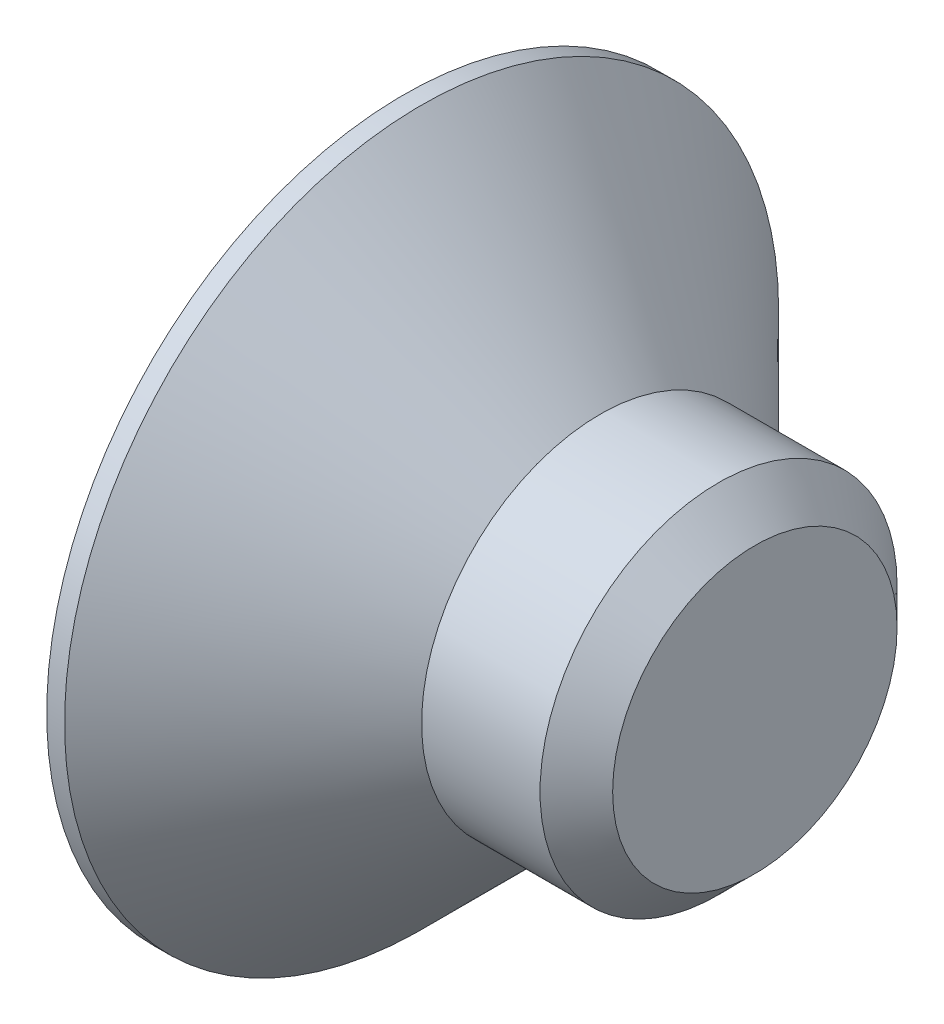
ISO-10303-21;
HEADER;
FILE_DESCRIPTION(('STEP AP214'),'2;1');
FILE_NAME('part.step','',(''),(''),'','','');
FILE_SCHEMA(('AUTOMOTIVE_DESIGN { 1 0 10303 214 1 1 1 1 }'));
ENDSEC;
DATA;
#1=APPLICATION_CONTEXT('core data for automotive mechanical design processes');
#2=APPLICATION_PROTOCOL_DEFINITION('international standard','automotive_design',2000,#1);
#3=PRODUCT_CONTEXT('',#1,'mechanical');
#4=PRODUCT('Part','Part','',(#3));
#5=PRODUCT_RELATED_PRODUCT_CATEGORY('part','',(#4));
#6=PRODUCT_DEFINITION_FORMATION('','',#4);
#7=PRODUCT_DEFINITION_CONTEXT('part definition',#1,'design');
#8=PRODUCT_DEFINITION('design','',#6,#7);
#9=PRODUCT_DEFINITION_SHAPE('','',#8);
#10=(LENGTH_UNIT() NAMED_UNIT(*) SI_UNIT(.MILLI.,.METRE.));
#11=(NAMED_UNIT(*) PLANE_ANGLE_UNIT() SI_UNIT($,.RADIAN.));
#12=(NAMED_UNIT(*) SI_UNIT($,.STERADIAN.) SOLID_ANGLE_UNIT());
#13=UNCERTAINTY_MEASURE_WITH_UNIT(LENGTH_MEASURE(1.E-05),#10,'distance_accuracy_value','');
#14=(GEOMETRIC_REPRESENTATION_CONTEXT(3) GLOBAL_UNCERTAINTY_ASSIGNED_CONTEXT((#13)) GLOBAL_UNIT_ASSIGNED_CONTEXT((#10,
#11,#12)) REPRESENTATION_CONTEXT('',''));
#15=CARTESIAN_POINT('',(0.,0.,0.));
#16=DIRECTION('',(0.,0.,1.));
#17=DIRECTION('',(1.,0.,0.));
#18=AXIS2_PLACEMENT_3D('',#15,#16,#17);
#19=CARTESIAN_POINT('',(500.,0.,0.));
#20=DIRECTION('',(1.,0.,0.));
#21=DIRECTION('',(0.,0.,-1.));
#22=AXIS2_PLACEMENT_3D('',#19,#20,#21);
#23=CYLINDRICAL_SURFACE('',#22,3.);
#24=CARTESIAN_POINT('',(5.28999999999996,0.,0.));
#25=DIRECTION('',(1.,0.,0.));
#26=DIRECTION('',(0.,0.,-1.));
#27=AXIS2_PLACEMENT_3D('',#24,#25,#26);
#28=CIRCLE('',#27,3.);
#29=CARTESIAN_POINT('',(5.28999999999996,0.,-3.));
#30=VERTEX_POINT('',#29);
#31=EDGE_CURVE('E11',#30,#30,#28,.F.);
#32=ORIENTED_EDGE('',*,*,#31,.T.);
#33=EDGE_LOOP('',(#32));
#34=FACE_BOUND('',#33,.T.);
#35=CARTESIAN_POINT('',(3.30000000000007,0.,0.));
#36=DIRECTION('',(1.,0.,0.));
#37=DIRECTION('',(0.,0.,-1.));
#38=AXIS2_PLACEMENT_3D('',#35,#36,#37);
#39=CIRCLE('',#38,3.);
#40=CARTESIAN_POINT('',(3.30000000000007,0.,-3.));
#41=VERTEX_POINT('',#40);
#42=EDGE_CURVE('E243',#41,#41,#39,.T.);
#43=ORIENTED_EDGE('',*,*,#42,.T.);
#44=EDGE_LOOP('',(#43));
#45=FACE_BOUND('',#44,.T.);
#46=ADVANCED_FACE('F40',(#34,#45),#23,.T.);
#47=CARTESIAN_POINT('',(0.,2.01,0.));
#48=DIRECTION('',(1.,0.,0.));
#49=DIRECTION('',(0.,0.,-1.));
#50=AXIS2_PLACEMENT_3D('',#47,#48,#49);
#51=PLANE('',#50);
#52=CARTESIAN_POINT('',(0.,0.,0.));
#53=DIRECTION('',(1.,0.,0.));
#54=DIRECTION('',(0.,0.,-1.));
#55=AXIS2_PLACEMENT_3D('',#52,#53,#54);
#56=CIRCLE('',#55,6.);
#57=CARTESIAN_POINT('',(0.,0.,-6.));
#58=VERTEX_POINT('',#57);
#59=EDGE_CURVE('E141',#58,#58,#56,.T.);
#60=ORIENTED_EDGE('',*,*,#59,.F.);
#61=EDGE_LOOP('',(#60));
#62=FACE_BOUND('',#61,.T.);
#63=DIRECTION('',(0.,-0.500000000000017,0.866025403784429));
#64=VECTOR('',#63,1.);
#65=CARTESIAN_POINT('',(0.,-1.1604740410711,-2.01));
#66=LINE('',#65,#64);
#67=CARTESIAN_POINT('',(0.,-1.1604740410711,-2.01));
#68=VERTEX_POINT('',#67);
#69=CARTESIAN_POINT('',(0.,-2.3209480821423,0.));
#70=VERTEX_POINT('',#69);
#71=EDGE_CURVE('E125',#68,#70,#66,.T.);
#72=ORIENTED_EDGE('',*,*,#71,.F.);
#73=DIRECTION('',(0.,-1.,0.));
#74=VECTOR('',#73,1.);
#75=CARTESIAN_POINT('',(0.,1.1604740410711,-2.01));
#76=LINE('',#75,#74);
#77=CARTESIAN_POINT('',(0.,1.1604740410711,-2.01));
#78=VERTEX_POINT('',#77);
#79=EDGE_CURVE('E113',#78,#68,#76,.T.);
#80=ORIENTED_EDGE('',*,*,#79,.F.);
#81=DIRECTION('',(0.,-0.500000000000017,-0.866025403784429));
#82=VECTOR('',#81,1.);
#83=CARTESIAN_POINT('',(0.,2.3209480821423,0.));
#84=LINE('',#83,#82);
#85=CARTESIAN_POINT('',(0.,2.3209480821423,0.));
#86=VERTEX_POINT('',#85);
#87=EDGE_CURVE('E124',#86,#78,#84,.T.);
#88=ORIENTED_EDGE('',*,*,#87,.F.);
#89=DIRECTION('',(0.,0.500000000000017,-0.866025403784429));
#90=VECTOR('',#89,1.);
#91=CARTESIAN_POINT('',(0.,1.1604740410711,2.01));
#92=LINE('',#91,#90);
#93=CARTESIAN_POINT('',(0.,1.1604740410711,2.01));
#94=VERTEX_POINT('',#93);
#95=EDGE_CURVE('E151',#94,#86,#92,.T.);
#96=ORIENTED_EDGE('',*,*,#95,.F.);
#97=DIRECTION('',(0.,1.,0.));
#98=VECTOR('',#97,1.);
#99=CARTESIAN_POINT('',(0.,-1.1604740410711,2.01));
#100=LINE('',#99,#98);
#101=CARTESIAN_POINT('',(0.,-1.1604740410711,2.01));
#102=VERTEX_POINT('',#101);
#103=EDGE_CURVE('E155',#102,#94,#100,.T.);
#104=ORIENTED_EDGE('',*,*,#103,.F.);
#105=DIRECTION('',(0.,0.500000000000017,0.866025403784429));
#106=VECTOR('',#105,1.);
#107=CARTESIAN_POINT('',(0.,-2.3209480821423,0.));
#108=LINE('',#107,#106);
#109=EDGE_CURVE('E140',#70,#102,#108,.T.);
#110=ORIENTED_EDGE('',*,*,#109,.F.);
#111=EDGE_LOOP('',(#72,#80,#88,#96,#104,#110));
#112=FACE_BOUND('',#111,.T.);
#113=ADVANCED_FACE('F138',(#62,#112),#51,.F.);
#114=CARTESIAN_POINT('',(500.,0.,0.));
#115=DIRECTION('',(1.,0.,0.));
#116=DIRECTION('',(0.,0.,-1.));
#117=AXIS2_PLACEMENT_3D('',#114,#115,#116);
#118=CYLINDRICAL_SURFACE('',#117,6.);
#119=CARTESIAN_POINT('',(0.300000000000078,0.,0.));
#120=DIRECTION('',(1.,0.,0.));
#121=DIRECTION('',(0.,0.,-1.));
#122=AXIS2_PLACEMENT_3D('',#119,#120,#121);
#123=CIRCLE('',#122,6.);
#124=CARTESIAN_POINT('',(0.300000000000078,0.,-6.));
#125=VERTEX_POINT('',#124);
#126=EDGE_CURVE('E162',#125,#125,#123,.T.);
#127=ORIENTED_EDGE('',*,*,#126,.F.);
#128=EDGE_LOOP('',(#127));
#129=FACE_BOUND('',#128,.T.);
#130=ORIENTED_EDGE('',*,*,#59,.T.);
#131=EDGE_LOOP('',(#130));
#132=FACE_BOUND('',#131,.T.);
#133=ADVANCED_FACE('F293',(#129,#132),#118,.T.);
#134=CARTESIAN_POINT('',(1.98,-2.3209480821423,0.));
#135=DIRECTION('',(0.,0.866025403784429,0.500000000000017));
#136=DIRECTION('',(0.,-0.500000000000017,0.866025403784429));
#137=AXIS2_PLACEMENT_3D('',#134,#135,#136);
#138=PLANE('',#137);
#139=DIRECTION('',(0.,0.500000000000017,-0.866025403784429));
#140=VECTOR('',#139,1.);
#141=CARTESIAN_POINT('',(1.98,-2.3209480821423,0.));
#142=LINE('',#141,#140);
#143=CARTESIAN_POINT('',(1.98,-2.3209480821423,0.));
#144=VERTEX_POINT('',#143);
#145=CARTESIAN_POINT('',(1.98,-1.74071106160668,-1.00500000000002));
#146=VERTEX_POINT('',#145);
#147=EDGE_CURVE('E167',#144,#146,#142,.T.);
#148=ORIENTED_EDGE('',*,*,#147,.T.);
#149=DIRECTION('',(0.,0.500000000000017,-0.866025403784429));
#150=VECTOR('',#149,1.);
#151=CARTESIAN_POINT('',(1.98,-1.74071106160669,-1.00500000000002));
#152=LINE('',#151,#150);
#153=CARTESIAN_POINT('',(1.98,-1.1604740410711,-2.01));
#154=VERTEX_POINT('',#153);
#155=EDGE_CURVE('E134',#146,#154,#152,.T.);
#156=ORIENTED_EDGE('',*,*,#155,.T.);
#157=DIRECTION('',(-1.,0.,0.));
#158=VECTOR('',#157,1.);
#159=CARTESIAN_POINT('',(1.98,-1.1604740410711,-2.01));
#160=LINE('',#159,#158);
#161=EDGE_CURVE('E117',#154,#68,#160,.T.);
#162=ORIENTED_EDGE('',*,*,#161,.T.);
#163=ORIENTED_EDGE('',*,*,#71,.T.);
#164=DIRECTION('',(-1.,0.,0.));
#165=VECTOR('',#164,1.);
#166=CARTESIAN_POINT('',(1.98,-2.3209480821423,0.));
#167=LINE('',#166,#165);
#168=EDGE_CURVE('E135',#144,#70,#167,.T.);
#169=ORIENTED_EDGE('',*,*,#168,.F.);
#170=EDGE_LOOP('',(#148,#156,#162,#163,#169));
#171=FACE_BOUND('',#170,.T.);
#172=ADVANCED_FACE('F131',(#171),#138,.T.);
#173=CARTESIAN_POINT('',(1.98,-1.1604740410711,-2.01));
#174=DIRECTION('',(0.,0.,1.));
#175=DIRECTION('',(1.,0.,0.));
#176=AXIS2_PLACEMENT_3D('',#173,#174,#175);
#177=PLANE('',#176);
#178=DIRECTION('',(0.,1.,0.));
#179=VECTOR('',#178,1.);
#180=CARTESIAN_POINT('',(1.98,-1.1604740410711,-2.01));
#181=LINE('',#180,#179);
#182=CARTESIAN_POINT('',(1.98,0.,-2.01));
#183=VERTEX_POINT('',#182);
#184=EDGE_CURVE('E177',#154,#183,#181,.T.);
#185=ORIENTED_EDGE('',*,*,#184,.T.);
#186=DIRECTION('',(0.,1.,0.));
#187=VECTOR('',#186,1.);
#188=CARTESIAN_POINT('',(1.98,0.,-2.01));
#189=LINE('',#188,#187);
#190=CARTESIAN_POINT('',(1.98,1.1604740410711,-2.01));
#191=VERTEX_POINT('',#190);
#192=EDGE_CURVE('E181',#183,#191,#189,.T.);
#193=ORIENTED_EDGE('',*,*,#192,.T.);
#194=DIRECTION('',(-1.,0.,0.));
#195=VECTOR('',#194,1.);
#196=CARTESIAN_POINT('',(1.98,1.1604740410711,-2.01));
#197=LINE('',#196,#195);
#198=EDGE_CURVE('E120',#191,#78,#197,.T.);
#199=ORIENTED_EDGE('',*,*,#198,.T.);
#200=ORIENTED_EDGE('',*,*,#79,.T.);
#201=ORIENTED_EDGE('',*,*,#161,.F.);
#202=EDGE_LOOP('',(#185,#193,#199,#200,#201));
#203=FACE_BOUND('',#202,.T.);
#204=ADVANCED_FACE('F116',(#203),#177,.T.);
#205=CARTESIAN_POINT('',(1.98,1.1604740410711,-2.01));
#206=DIRECTION('',(0.,-0.866025403784429,0.500000000000017));
#207=DIRECTION('',(0.,-0.500000000000017,-0.866025403784429));
#208=AXIS2_PLACEMENT_3D('',#205,#206,#207);
#209=PLANE('',#208);
#210=DIRECTION('',(0.,0.500000000000017,0.866025403784429));
#211=VECTOR('',#210,1.);
#212=CARTESIAN_POINT('',(1.98,1.1604740410711,-2.01));
#213=LINE('',#212,#211);
#214=CARTESIAN_POINT('',(1.98,1.74071106160668,-1.00500000000002));
#215=VERTEX_POINT('',#214);
#216=EDGE_CURVE('E188',#191,#215,#213,.T.);
#217=ORIENTED_EDGE('',*,*,#216,.T.);
#218=DIRECTION('',(0.,0.500000000000017,0.866025403784429));
#219=VECTOR('',#218,1.);
#220=CARTESIAN_POINT('',(1.98,1.74071106160669,-1.00500000000002));
#221=LINE('',#220,#219);
#222=CARTESIAN_POINT('',(1.98,2.3209480821423,0.));
#223=VERTEX_POINT('',#222);
#224=EDGE_CURVE('E193',#215,#223,#221,.T.);
#225=ORIENTED_EDGE('',*,*,#224,.T.);
#226=DIRECTION('',(-1.,0.,0.));
#227=VECTOR('',#226,1.);
#228=CARTESIAN_POINT('',(1.98,2.3209480821423,0.));
#229=LINE('',#228,#227);
#230=EDGE_CURVE('E198',#223,#86,#229,.T.);
#231=ORIENTED_EDGE('',*,*,#230,.T.);
#232=ORIENTED_EDGE('',*,*,#87,.T.);
#233=ORIENTED_EDGE('',*,*,#198,.F.);
#234=EDGE_LOOP('',(#217,#225,#231,#232,#233));
#235=FACE_BOUND('',#234,.T.);
#236=ADVANCED_FACE('F314',(#235),#209,.T.);
#237=CARTESIAN_POINT('',(1.98,2.3209480821423,0.));
#238=DIRECTION('',(0.,-0.866025403784429,-0.500000000000017));
#239=DIRECTION('',(0.,0.500000000000017,-0.866025403784429));
#240=AXIS2_PLACEMENT_3D('',#237,#238,#239);
#241=PLANE('',#240);
#242=DIRECTION('',(0.,-0.500000000000017,0.866025403784429));
#243=VECTOR('',#242,1.);
#244=CARTESIAN_POINT('',(1.98,2.3209480821423,0.));
#245=LINE('',#244,#243);
#246=CARTESIAN_POINT('',(1.98,1.74071106160668,1.00500000000002));
#247=VERTEX_POINT('',#246);
#248=EDGE_CURVE('E203',#223,#247,#245,.T.);
#249=ORIENTED_EDGE('',*,*,#248,.T.);
#250=DIRECTION('',(0.,-0.500000000000017,0.866025403784429));
#251=VECTOR('',#250,1.);
#252=CARTESIAN_POINT('',(1.98,1.74071106160669,1.00500000000002));
#253=LINE('',#252,#251);
#254=CARTESIAN_POINT('',(1.98,1.1604740410711,2.01));
#255=VERTEX_POINT('',#254);
#256=EDGE_CURVE('E208',#247,#255,#253,.T.);
#257=ORIENTED_EDGE('',*,*,#256,.T.);
#258=DIRECTION('',(-1.,0.,0.));
#259=VECTOR('',#258,1.);
#260=CARTESIAN_POINT('',(1.98,1.1604740410711,2.01));
#261=LINE('',#260,#259);
#262=EDGE_CURVE('E213',#255,#94,#261,.T.);
#263=ORIENTED_EDGE('',*,*,#262,.T.);
#264=ORIENTED_EDGE('',*,*,#95,.T.);
#265=ORIENTED_EDGE('',*,*,#230,.F.);
#266=EDGE_LOOP('',(#249,#257,#263,#264,#265));
#267=FACE_BOUND('',#266,.T.);
#268=ADVANCED_FACE('F320',(#267),#241,.T.);
#269=CARTESIAN_POINT('',(1.98,1.1604740410711,2.01));
#270=DIRECTION('',(0.,0.,-1.));
#271=DIRECTION('',(-1.,0.,0.));
#272=AXIS2_PLACEMENT_3D('',#269,#270,#271);
#273=PLANE('',#272);
#274=DIRECTION('',(0.,-1.,0.));
#275=VECTOR('',#274,1.);
#276=CARTESIAN_POINT('',(1.98,1.1604740410711,2.01));
#277=LINE('',#276,#275);
#278=CARTESIAN_POINT('',(1.98,0.,2.01));
#279=VERTEX_POINT('',#278);
#280=EDGE_CURVE('E218',#255,#279,#277,.T.);
#281=ORIENTED_EDGE('',*,*,#280,.T.);
#282=DIRECTION('',(0.,-1.,0.));
#283=VECTOR('',#282,1.);
#284=CARTESIAN_POINT('',(1.98,0.,2.01));
#285=LINE('',#284,#283);
#286=CARTESIAN_POINT('',(1.98,-1.1604740410711,2.01));
#287=VERTEX_POINT('',#286);
#288=EDGE_CURVE('E223',#279,#287,#285,.T.);
#289=ORIENTED_EDGE('',*,*,#288,.T.);
#290=DIRECTION('',(-1.,0.,0.));
#291=VECTOR('',#290,1.);
#292=CARTESIAN_POINT('',(1.98,-1.1604740410711,2.01));
#293=LINE('',#292,#291);
#294=EDGE_CURVE('E228',#287,#102,#293,.T.);
#295=ORIENTED_EDGE('',*,*,#294,.T.);
#296=ORIENTED_EDGE('',*,*,#103,.T.);
#297=ORIENTED_EDGE('',*,*,#262,.F.);
#298=EDGE_LOOP('',(#281,#289,#295,#296,#297));
#299=FACE_BOUND('',#298,.T.);
#300=ADVANCED_FACE('F325',(#299),#273,.T.);
#301=CARTESIAN_POINT('',(1.98,-1.1604740410711,2.01));
#302=DIRECTION('',(0.,0.866025403784429,-0.500000000000017));
#303=DIRECTION('',(0.,0.500000000000017,0.866025403784429));
#304=AXIS2_PLACEMENT_3D('',#301,#302,#303);
#305=PLANE('',#304);
#306=DIRECTION('',(0.,-0.500000000000017,-0.866025403784429));
#307=VECTOR('',#306,1.);
#308=CARTESIAN_POINT('',(1.98,-1.1604740410711,2.01));
#309=LINE('',#308,#307);
#310=CARTESIAN_POINT('',(1.98,-1.74071106160668,1.00500000000002));
#311=VERTEX_POINT('',#310);
#312=EDGE_CURVE('E233',#287,#311,#309,.T.);
#313=ORIENTED_EDGE('',*,*,#312,.T.);
#314=DIRECTION('',(0.,-0.500000000000017,-0.866025403784429));
#315=VECTOR('',#314,1.);
#316=CARTESIAN_POINT('',(1.98,-1.74071106160669,1.00500000000002));
#317=LINE('',#316,#315);
#318=EDGE_CURVE('E238',#311,#144,#317,.T.);
#319=ORIENTED_EDGE('',*,*,#318,.T.);
#320=ORIENTED_EDGE('',*,*,#168,.T.);
#321=ORIENTED_EDGE('',*,*,#109,.T.);
#322=ORIENTED_EDGE('',*,*,#294,.F.);
#323=EDGE_LOOP('',(#313,#319,#320,#321,#322));
#324=FACE_BOUND('',#323,.T.);
#325=ADVANCED_FACE('F329',(#324),#305,.T.);
#326=CARTESIAN_POINT('',(0.300000000000078,0.,0.));
#327=DIRECTION('',(-1.,0.,0.));
#328=DIRECTION('',(0.,0.,1.));
#329=AXIS2_PLACEMENT_3D('',#326,#327,#328);
#330=CONICAL_SURFACE('',#329,6.,0.785398163397448);
#331=ORIENTED_EDGE('',*,*,#42,.F.);
#332=EDGE_LOOP('',(#331));
#333=FACE_BOUND('',#332,.T.);
#334=ORIENTED_EDGE('',*,*,#126,.T.);
#335=EDGE_LOOP('',(#334));
#336=FACE_BOUND('',#335,.T.);
#337=ADVANCED_FACE('F333',(#333,#336),#330,.T.);
#338=CARTESIAN_POINT('',(1.98,0.,0.));
#339=DIRECTION('',(1.,0.,0.));
#340=DIRECTION('',(0.,0.,-1.));
#341=AXIS2_PLACEMENT_3D('',#338,#339,#340);
#342=PLANE('',#341);
#343=ORIENTED_EDGE('',*,*,#147,.F.);
#344=ORIENTED_EDGE('',*,*,#318,.F.);
#345=CARTESIAN_POINT('',(1.98,0.,0.));
#346=DIRECTION('',(1.,0.,0.));
#347=DIRECTION('',(0.,-0.866025403784429,0.500000000000017));
#348=AXIS2_PLACEMENT_3D('',#345,#346,#347);
#349=CIRCLE('',#348,2.00999999999997);
#350=EDGE_CURVE('E59',#311,#146,#349,.T.);
#351=ORIENTED_EDGE('',*,*,#350,.T.);
#352=EDGE_LOOP('',(#343,#344,#351));
#353=FACE_BOUND('',#352,.T.);
#354=ADVANCED_FACE('F298',(#353),#342,.F.);
#355=ORIENTED_EDGE('',*,*,#184,.F.);
#356=ORIENTED_EDGE('',*,*,#155,.F.);
#357=CARTESIAN_POINT('',(1.98,0.,0.));
#358=DIRECTION('',(1.,0.,0.));
#359=DIRECTION('',(0.,-0.866025403784429,-0.500000000000016));
#360=AXIS2_PLACEMENT_3D('',#357,#358,#359);
#361=CIRCLE('',#360,2.00999999999997);
#362=EDGE_CURVE('E249',#146,#183,#361,.T.);
#363=ORIENTED_EDGE('',*,*,#362,.T.);
#364=EDGE_LOOP('',(#355,#356,#363));
#365=FACE_BOUND('',#364,.T.);
#366=ADVANCED_FACE('F310',(#365),#342,.F.);
#367=ORIENTED_EDGE('',*,*,#216,.F.);
#368=ORIENTED_EDGE('',*,*,#192,.F.);
#369=CARTESIAN_POINT('',(1.98,0.,0.));
#370=DIRECTION('',(1.,0.,0.));
#371=DIRECTION('',(0.,0.,-1.));
#372=AXIS2_PLACEMENT_3D('',#369,#370,#371);
#373=CIRCLE('',#372,2.00999999999997);
#374=EDGE_CURVE('E254',#183,#215,#373,.T.);
#375=ORIENTED_EDGE('',*,*,#374,.T.);
#376=EDGE_LOOP('',(#367,#368,#375));
#377=FACE_BOUND('',#376,.T.);
#378=ADVANCED_FACE('F311',(#377),#342,.F.);
#379=ORIENTED_EDGE('',*,*,#248,.F.);
#380=ORIENTED_EDGE('',*,*,#224,.F.);
#381=CARTESIAN_POINT('',(1.98,0.,0.));
#382=DIRECTION('',(1.,0.,0.));
#383=DIRECTION('',(0.,0.866025403784429,-0.500000000000017));
#384=AXIS2_PLACEMENT_3D('',#381,#382,#383);
#385=CIRCLE('',#384,2.00999999999997);
#386=EDGE_CURVE('E259',#215,#247,#385,.T.);
#387=ORIENTED_EDGE('',*,*,#386,.T.);
#388=EDGE_LOOP('',(#379,#380,#387));
#389=FACE_BOUND('',#388,.T.);
#390=ADVANCED_FACE('F317',(#389),#342,.F.);
#391=ORIENTED_EDGE('',*,*,#280,.F.);
#392=ORIENTED_EDGE('',*,*,#256,.F.);
#393=CARTESIAN_POINT('',(1.98,0.,0.));
#394=DIRECTION('',(1.,0.,0.));
#395=DIRECTION('',(0.,0.866025403784429,0.500000000000017));
#396=AXIS2_PLACEMENT_3D('',#393,#394,#395);
#397=CIRCLE('',#396,2.00999999999997);
#398=EDGE_CURVE('E264',#247,#279,#397,.T.);
#399=ORIENTED_EDGE('',*,*,#398,.T.);
#400=EDGE_LOOP('',(#391,#392,#399));
#401=FACE_BOUND('',#400,.T.);
#402=ADVANCED_FACE('F305',(#401),#342,.F.);
#403=ORIENTED_EDGE('',*,*,#312,.F.);
#404=ORIENTED_EDGE('',*,*,#288,.F.);
#405=CARTESIAN_POINT('',(1.98,0.,0.));
#406=DIRECTION('',(1.,0.,0.));
#407=DIRECTION('',(0.,0.,1.));
#408=AXIS2_PLACEMENT_3D('',#405,#406,#407);
#409=CIRCLE('',#408,2.00999999999997);
#410=EDGE_CURVE('E269',#279,#311,#409,.T.);
#411=ORIENTED_EDGE('',*,*,#410,.T.);
#412=EDGE_LOOP('',(#403,#404,#411));
#413=FACE_BOUND('',#412,.T.);
#414=ADVANCED_FACE('F301',(#413),#342,.F.);
#415=CARTESIAN_POINT('',(3.1404740410711,0.,0.));
#416=DIRECTION('',(-1.,0.,0.));
#417=DIRECTION('',(0.,0.,1.));
#418=AXIS2_PLACEMENT_3D('',#415,#416,#417);
#419=CONICAL_SURFACE('',#418,0.,1.04719755119661);
#420=ORIENTED_EDGE('',*,*,#374,.F.);
#421=ORIENTED_EDGE('',*,*,#362,.F.);
#422=ORIENTED_EDGE('',*,*,#350,.F.);
#423=ORIENTED_EDGE('',*,*,#410,.F.);
#424=ORIENTED_EDGE('',*,*,#398,.F.);
#425=ORIENTED_EDGE('',*,*,#386,.F.);
#426=EDGE_LOOP('',(#420,#421,#422,#423,#424,#425));
#427=FACE_BOUND('',#426,.T.);
#428=CARTESIAN_POINT('',(3.1404740410711,0.,0.));
#429=VERTEX_POINT('',#428);
#430=VERTEX_LOOP('',#429);
#431=FACE_BOUND('',#430,.T.);
#432=ADVANCED_FACE('F284',(#427,#431),#419,.F.);
#433=CARTESIAN_POINT('',(5.9,0.,0.));
#434=DIRECTION('',(1.,0.,0.));
#435=DIRECTION('',(0.,0.,-1.));
#436=AXIS2_PLACEMENT_3D('',#433,#434,#435);
#437=PLANE('',#436);
#438=CARTESIAN_POINT('',(5.9,0.,0.));
#439=DIRECTION('',(1.,0.,0.));
#440=DIRECTION('',(0.,0.,-1.));
#441=AXIS2_PLACEMENT_3D('',#438,#439,#440);
#442=CIRCLE('',#441,2.38999999999999);
#443=CARTESIAN_POINT('',(5.9,0.,-2.38999999999999));
#444=VERTEX_POINT('',#443);
#445=EDGE_CURVE('E49',#444,#444,#442,.T.);
#446=ORIENTED_EDGE('',*,*,#445,.T.);
#447=EDGE_LOOP('',(#446));
#448=FACE_BOUND('',#447,.T.);
#449=ADVANCED_FACE('F277',(#448),#437,.T.);
#450=CARTESIAN_POINT('',(5.90000000000002,0.,0.));
#451=DIRECTION('',(-1.,0.,0.));
#452=DIRECTION('',(0.,0.,1.));
#453=AXIS2_PLACEMENT_3D('',#450,#451,#452);
#454=CONICAL_SURFACE('',#453,2.38999999999997,0.785398163397425);
#455=ORIENTED_EDGE('',*,*,#31,.F.);
#456=EDGE_LOOP('',(#455));
#457=FACE_BOUND('',#456,.T.);
#458=ORIENTED_EDGE('',*,*,#445,.F.);
#459=EDGE_LOOP('',(#458));
#460=FACE_BOUND('',#459,.T.);
#461=ADVANCED_FACE('F43',(#457,#460),#454,.T.);
#462=CLOSED_SHELL('',(#46,#113,#133,#172,#204,#236,#268,#300,#325,#337,#354,#366,#378,#390,#402,
#414,#432,#449,#461));
#463=MANIFOLD_SOLID_BREP('B2',#462);
#464=ADVANCED_BREP_SHAPE_REPRESENTATION('',(#18,#463),#14);
#465=SHAPE_DEFINITION_REPRESENTATION(#9,#464);
ENDSEC;
END-ISO-10303-21;
